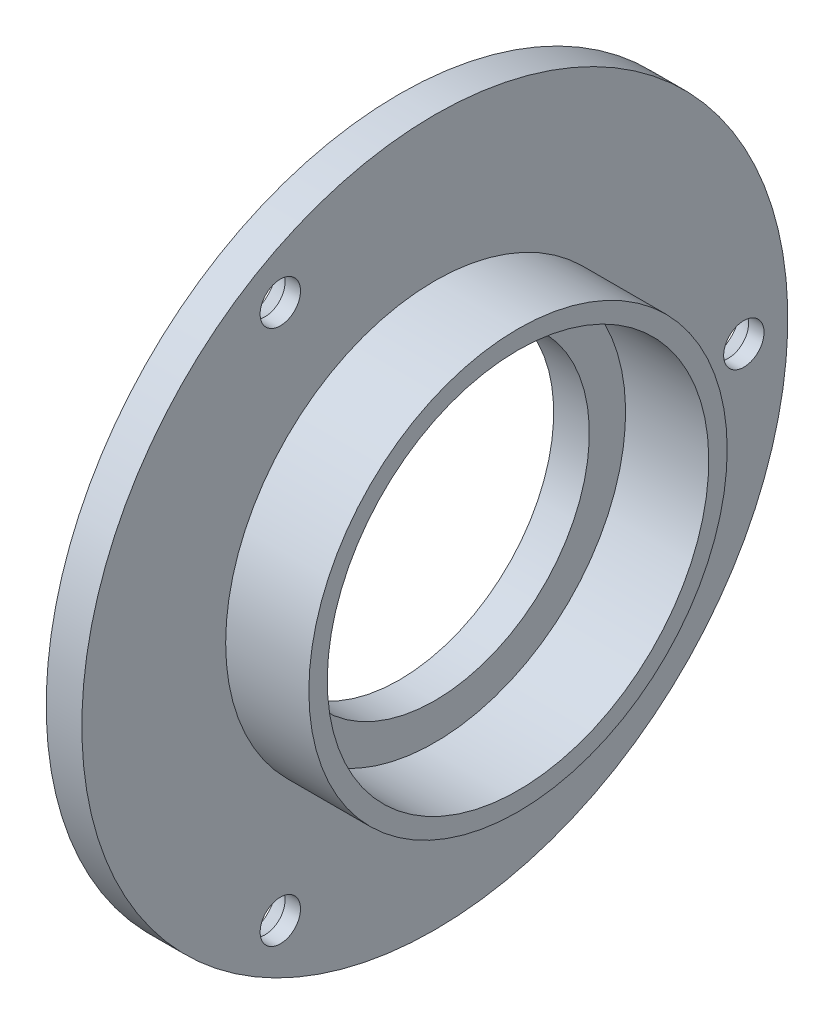
ISO-10303-21;
HEADER;
FILE_DESCRIPTION(('STEP AP214'),'2;1');
FILE_NAME('part.step','',(''),(''),'','','');
FILE_SCHEMA(('AUTOMOTIVE_DESIGN { 1 0 10303 214 1 1 1 1 }'));
ENDSEC;
DATA;
#1=APPLICATION_CONTEXT('core data for automotive mechanical design processes');
#2=APPLICATION_PROTOCOL_DEFINITION('international standard','automotive_design',2000,#1);
#3=PRODUCT_CONTEXT('',#1,'mechanical');
#4=PRODUCT('Part','Part','',(#3));
#5=PRODUCT_RELATED_PRODUCT_CATEGORY('part','',(#4));
#6=PRODUCT_DEFINITION_FORMATION('','',#4);
#7=PRODUCT_DEFINITION_CONTEXT('part definition',#1,'design');
#8=PRODUCT_DEFINITION('design','',#6,#7);
#9=PRODUCT_DEFINITION_SHAPE('','',#8);
#10=(LENGTH_UNIT() NAMED_UNIT(*) SI_UNIT(.MILLI.,.METRE.));
#11=(NAMED_UNIT(*) PLANE_ANGLE_UNIT() SI_UNIT($,.RADIAN.));
#12=(NAMED_UNIT(*) SI_UNIT($,.STERADIAN.) SOLID_ANGLE_UNIT());
#13=UNCERTAINTY_MEASURE_WITH_UNIT(LENGTH_MEASURE(1.E-05),#10,'distance_accuracy_value','');
#14=(GEOMETRIC_REPRESENTATION_CONTEXT(3) GLOBAL_UNCERTAINTY_ASSIGNED_CONTEXT((#13)) GLOBAL_UNIT_ASSIGNED_CONTEXT((#10,
#11,#12)) REPRESENTATION_CONTEXT('',''));
#15=CARTESIAN_POINT('',(0.,0.,0.));
#16=DIRECTION('',(0.,0.,1.));
#17=DIRECTION('',(1.,0.,0.));
#18=AXIS2_PLACEMENT_3D('',#15,#16,#17);
#19=CARTESIAN_POINT('',(-29.5,0.,0.));
#20=DIRECTION('',(1.,0.,0.));
#21=DIRECTION('',(0.,1.,0.));
#22=AXIS2_PLACEMENT_3D('',#19,#20,#21);
#23=PLANE('',#22);
#24=CARTESIAN_POINT('',(-29.5,0.,0.));
#25=DIRECTION('',(1.,0.,0.));
#26=DIRECTION('',(0.,1.,0.));
#27=AXIS2_PLACEMENT_3D('',#24,#25,#26);
#28=CIRCLE('',#27,16.05);
#29=CARTESIAN_POINT('',(-29.5,16.05,0.));
#30=VERTEX_POINT('',#29);
#31=EDGE_CURVE('E25',#30,#30,#28,.T.);
#32=ORIENTED_EDGE('',*,*,#31,.F.);
#33=EDGE_LOOP('',(#32));
#34=FACE_BOUND('',#33,.T.);
#35=CARTESIAN_POINT('',(-29.5,0.,0.));
#36=DIRECTION('',(1.,0.,0.));
#37=DIRECTION('',(0.,1.,0.));
#38=AXIS2_PLACEMENT_3D('',#35,#36,#37);
#39=CIRCLE('',#38,17.6);
#40=CARTESIAN_POINT('',(-29.5,17.6,0.));
#41=VERTEX_POINT('',#40);
#42=EDGE_CURVE('E46',#41,#41,#39,.T.);
#43=ORIENTED_EDGE('',*,*,#42,.T.);
#44=EDGE_LOOP('',(#43));
#45=FACE_BOUND('',#44,.T.);
#46=ADVANCED_FACE('F15',(#34,#45),#23,.T.);
#47=CARTESIAN_POINT('',(-29.5,0.,0.));
#48=DIRECTION('',(-1.,0.,0.));
#49=DIRECTION('',(0.,1.,0.));
#50=AXIS2_PLACEMENT_3D('',#47,#48,#49);
#51=CYLINDRICAL_SURFACE('',#50,16.05);
#52=ORIENTED_EDGE('',*,*,#31,.T.);
#53=DIRECTION('',(-1.,0.,0.));
#54=VECTOR('',#53,1.);
#55=CARTESIAN_POINT('',(-29.5,16.05,0.));
#56=LINE('',#55,#54);
#57=CARTESIAN_POINT('',(-36.5,16.05,0.));
#58=VERTEX_POINT('',#57);
#59=EDGE_CURVE('E10',#30,#58,#56,.T.);
#60=ORIENTED_EDGE('',*,*,#59,.T.);
#61=CARTESIAN_POINT('',(-36.5,0.,0.));
#62=DIRECTION('',(1.,0.,0.));
#63=DIRECTION('',(0.,1.,0.));
#64=AXIS2_PLACEMENT_3D('',#61,#62,#63);
#65=CIRCLE('',#64,16.05);
#66=EDGE_CURVE('E151',#58,#58,#65,.T.);
#67=ORIENTED_EDGE('',*,*,#66,.F.);
#68=ORIENTED_EDGE('',*,*,#59,.F.);
#69=EDGE_LOOP('',(#52,#60,#67,#68));
#70=FACE_BOUND('',#69,.T.);
#71=ADVANCED_FACE('F17',(#70),#51,.F.);
#72=CARTESIAN_POINT('',(-36.5,0.,0.));
#73=DIRECTION('',(1.,0.,0.));
#74=DIRECTION('',(0.,1.,0.));
#75=AXIS2_PLACEMENT_3D('',#72,#73,#74);
#76=CYLINDRICAL_SURFACE('',#75,17.6);
#77=CARTESIAN_POINT('',(-36.5,0.,0.));
#78=DIRECTION('',(1.,0.,0.));
#79=DIRECTION('',(0.,1.,0.));
#80=AXIS2_PLACEMENT_3D('',#77,#78,#79);
#81=CIRCLE('',#80,17.6);
#82=CARTESIAN_POINT('',(-36.5,17.6,0.));
#83=VERTEX_POINT('',#82);
#84=EDGE_CURVE('E147',#83,#83,#81,.T.);
#85=ORIENTED_EDGE('',*,*,#84,.T.);
#86=DIRECTION('',(1.,0.,0.));
#87=VECTOR('',#86,1.);
#88=CARTESIAN_POINT('',(-36.5,17.6,0.));
#89=LINE('',#88,#87);
#90=EDGE_CURVE('E150',#83,#41,#89,.T.);
#91=ORIENTED_EDGE('',*,*,#90,.T.);
#92=ORIENTED_EDGE('',*,*,#42,.F.);
#93=ORIENTED_EDGE('',*,*,#90,.F.);
#94=EDGE_LOOP('',(#85,#91,#92,#93));
#95=FACE_BOUND('',#94,.T.);
#96=ADVANCED_FACE('F217',(#95),#76,.T.);
#97=CARTESIAN_POINT('',(-39.6,-22.51666049839,13.));
#98=DIRECTION('',(1.,0.,0.));
#99=DIRECTION('',(0.,0.,-1.));
#100=AXIS2_PLACEMENT_3D('',#97,#98,#99);
#101=CYLINDRICAL_SURFACE('',#100,1.7);
#102=CARTESIAN_POINT('',(-37.8,-22.51666049839,13.));
#103=DIRECTION('',(1.,0.,0.));
#104=DIRECTION('',(0.,0.,-1.));
#105=AXIS2_PLACEMENT_3D('',#102,#103,#104);
#106=CIRCLE('',#105,1.7);
#107=CARTESIAN_POINT('',(-37.8,-22.51666049839,11.3));
#108=VERTEX_POINT('',#107);
#109=EDGE_CURVE('E177',#108,#108,#106,.T.);
#110=ORIENTED_EDGE('',*,*,#109,.F.);
#111=DIRECTION('',(1.,0.,0.));
#112=VECTOR('',#111,1.);
#113=CARTESIAN_POINT('',(-39.6,-22.51666049839,11.3));
#114=LINE('',#113,#112);
#115=CARTESIAN_POINT('',(-36.5,-22.51666049839,11.3));
#116=VERTEX_POINT('',#115);
#117=EDGE_CURVE('E148',#108,#116,#114,.T.);
#118=ORIENTED_EDGE('',*,*,#117,.T.);
#119=CARTESIAN_POINT('',(-36.5,-22.51666049839,13.));
#120=DIRECTION('',(1.,0.,0.));
#121=DIRECTION('',(0.,0.,-1.));
#122=AXIS2_PLACEMENT_3D('',#119,#120,#121);
#123=CIRCLE('',#122,1.7);
#124=EDGE_CURVE('E180',#116,#116,#123,.T.);
#125=ORIENTED_EDGE('',*,*,#124,.T.);
#126=ORIENTED_EDGE('',*,*,#117,.F.);
#127=EDGE_LOOP('',(#110,#118,#125,#126));
#128=FACE_BOUND('',#127,.T.);
#129=ADVANCED_FACE('F249',(#128),#101,.F.);
#130=CARTESIAN_POINT('',(-36.5,0.,0.));
#131=DIRECTION('',(1.,0.,0.));
#132=DIRECTION('',(0.,1.,0.));
#133=AXIS2_PLACEMENT_3D('',#130,#131,#132);
#134=PLANE('',#133);
#135=CARTESIAN_POINT('',(-36.5,0.,0.));
#136=DIRECTION('',(1.,0.,0.));
#137=DIRECTION('',(0.,1.,0.));
#138=AXIS2_PLACEMENT_3D('',#135,#136,#137);
#139=CIRCLE('',#138,13.);
#140=CARTESIAN_POINT('',(-36.5,13.,0.));
#141=VERTEX_POINT('',#140);
#142=EDGE_CURVE('E167',#141,#141,#139,.T.);
#143=ORIENTED_EDGE('',*,*,#142,.F.);
#144=EDGE_LOOP('',(#143));
#145=FACE_BOUND('',#144,.T.);
#146=ORIENTED_EDGE('',*,*,#66,.T.);
#147=EDGE_LOOP('',(#146));
#148=FACE_BOUND('',#147,.T.);
#149=ADVANCED_FACE('F251',(#145,#148),#134,.T.);
#150=CARTESIAN_POINT('',(-39.6,22.516660498395,13.));
#151=DIRECTION('',(1.,0.,0.));
#152=DIRECTION('',(0.,0.,-1.));
#153=AXIS2_PLACEMENT_3D('',#150,#151,#152);
#154=CYLINDRICAL_SURFACE('',#153,1.7);
#155=CARTESIAN_POINT('',(-37.8,22.516660498395,13.));
#156=DIRECTION('',(1.,0.,0.));
#157=DIRECTION('',(0.,0.,-1.));
#158=AXIS2_PLACEMENT_3D('',#155,#156,#157);
#159=CIRCLE('',#158,1.7);
#160=CARTESIAN_POINT('',(-37.8,22.516660498395,11.3));
#161=VERTEX_POINT('',#160);
#162=EDGE_CURVE('E142',#161,#161,#159,.T.);
#163=ORIENTED_EDGE('',*,*,#162,.F.);
#164=DIRECTION('',(1.,0.,0.));
#165=VECTOR('',#164,1.);
#166=CARTESIAN_POINT('',(-39.6,22.516660498395,11.3));
#167=LINE('',#166,#165);
#168=CARTESIAN_POINT('',(-36.5,22.516660498395,11.3));
#169=VERTEX_POINT('',#168);
#170=EDGE_CURVE('E129',#161,#169,#167,.T.);
#171=ORIENTED_EDGE('',*,*,#170,.T.);
#172=CARTESIAN_POINT('',(-36.5,22.516660498395,13.));
#173=DIRECTION('',(1.,0.,0.));
#174=DIRECTION('',(0.,0.,-1.));
#175=AXIS2_PLACEMENT_3D('',#172,#173,#174);
#176=CIRCLE('',#175,1.7);
#177=EDGE_CURVE('E130',#169,#169,#176,.T.);
#178=ORIENTED_EDGE('',*,*,#177,.T.);
#179=ORIENTED_EDGE('',*,*,#170,.F.);
#180=EDGE_LOOP('',(#163,#171,#178,#179));
#181=FACE_BOUND('',#180,.T.);
#182=ADVANCED_FACE('F234',(#181),#154,.F.);
#183=CARTESIAN_POINT('',(-39.6,0.,-26.));
#184=DIRECTION('',(1.,0.,0.));
#185=DIRECTION('',(0.,0.,-1.));
#186=AXIS2_PLACEMENT_3D('',#183,#184,#185);
#187=CYLINDRICAL_SURFACE('',#186,1.7);
#188=CARTESIAN_POINT('',(-37.8,0.,-26.));
#189=DIRECTION('',(1.,0.,0.));
#190=DIRECTION('',(0.,0.,-1.));
#191=AXIS2_PLACEMENT_3D('',#188,#189,#190);
#192=CIRCLE('',#191,1.7);
#193=CARTESIAN_POINT('',(-37.8,0.,-27.7));
#194=VERTEX_POINT('',#193);
#195=EDGE_CURVE('E124',#194,#194,#192,.T.);
#196=ORIENTED_EDGE('',*,*,#195,.F.);
#197=DIRECTION('',(1.,0.,0.));
#198=VECTOR('',#197,1.);
#199=CARTESIAN_POINT('',(-39.6,0.,-27.7));
#200=LINE('',#199,#198);
#201=CARTESIAN_POINT('',(-36.5,0.,-27.7));
#202=VERTEX_POINT('',#201);
#203=EDGE_CURVE('E121',#194,#202,#200,.T.);
#204=ORIENTED_EDGE('',*,*,#203,.T.);
#205=CARTESIAN_POINT('',(-36.5,0.,-26.));
#206=DIRECTION('',(1.,0.,0.));
#207=DIRECTION('',(0.,0.,-1.));
#208=AXIS2_PLACEMENT_3D('',#205,#206,#207);
#209=CIRCLE('',#208,1.7);
#210=EDGE_CURVE('E127',#202,#202,#209,.T.);
#211=ORIENTED_EDGE('',*,*,#210,.T.);
#212=ORIENTED_EDGE('',*,*,#203,.F.);
#213=EDGE_LOOP('',(#196,#204,#211,#212));
#214=FACE_BOUND('',#213,.T.);
#215=ADVANCED_FACE('F123',(#214),#187,.F.);
#216=CARTESIAN_POINT('',(-36.5,0.,0.));
#217=DIRECTION('',(1.,0.,0.));
#218=DIRECTION('',(0.,1.,0.));
#219=AXIS2_PLACEMENT_3D('',#216,#217,#218);
#220=PLANE('',#219);
#221=ORIENTED_EDGE('',*,*,#177,.F.);
#222=EDGE_LOOP('',(#221));
#223=FACE_BOUND('',#222,.T.);
#224=ORIENTED_EDGE('',*,*,#84,.F.);
#225=EDGE_LOOP('',(#224));
#226=FACE_BOUND('',#225,.T.);
#227=ORIENTED_EDGE('',*,*,#124,.F.);
#228=EDGE_LOOP('',(#227));
#229=FACE_BOUND('',#228,.T.);
#230=ORIENTED_EDGE('',*,*,#210,.F.);
#231=EDGE_LOOP('',(#230));
#232=FACE_BOUND('',#231,.T.);
#233=CARTESIAN_POINT('',(-36.5,0.,0.));
#234=DIRECTION('',(1.,0.,0.));
#235=DIRECTION('',(0.,1.,0.));
#236=AXIS2_PLACEMENT_3D('',#233,#234,#235);
#237=CIRCLE('',#236,29.7);
#238=CARTESIAN_POINT('',(-36.5,29.7,0.));
#239=VERTEX_POINT('',#238);
#240=EDGE_CURVE('E115',#239,#239,#237,.T.);
#241=ORIENTED_EDGE('',*,*,#240,.T.);
#242=EDGE_LOOP('',(#241));
#243=FACE_BOUND('',#242,.T.);
#244=ADVANCED_FACE('F219',(#223,#226,#229,#232,#243),#220,.T.);
#245=CARTESIAN_POINT('',(-39.5,-22.51666049839,13.));
#246=DIRECTION('',(-1.,0.,0.));
#247=DIRECTION('',(0.,0.,-1.));
#248=AXIS2_PLACEMENT_3D('',#245,#246,#247);
#249=CONICAL_SURFACE('',#248,2.75,0.553294325322);
#250=DIRECTION('',(0.850797997359174,0.,0.525492880722107));
#251=VECTOR('',#250,1.);
#252=CARTESIAN_POINT('',(-39.5,-22.51666049839,10.25));
#253=LINE('',#252,#251);
#254=CARTESIAN_POINT('',(-39.5,-22.51666049839,10.25));
#255=VERTEX_POINT('',#254);
#256=EDGE_CURVE('E173',#255,#108,#253,.T.);
#257=ORIENTED_EDGE('',*,*,#256,.F.);
#258=CARTESIAN_POINT('',(-39.5,-22.51666049839,13.));
#259=DIRECTION('',(1.,0.,0.));
#260=DIRECTION('',(0.,0.,-1.));
#261=AXIS2_PLACEMENT_3D('',#258,#259,#260);
#262=CIRCLE('',#261,2.75);
#263=EDGE_CURVE('E159',#255,#255,#262,.T.);
#264=ORIENTED_EDGE('',*,*,#263,.F.);
#265=ORIENTED_EDGE('',*,*,#256,.T.);
#266=ORIENTED_EDGE('',*,*,#109,.T.);
#267=EDGE_LOOP('',(#257,#264,#265,#266));
#268=FACE_BOUND('',#267,.T.);
#269=ADVANCED_FACE('F222',(#268),#249,.F.);
#270=CARTESIAN_POINT('',(-36.5,0.,0.));
#271=DIRECTION('',(-1.,0.,0.));
#272=DIRECTION('',(0.,1.,0.));
#273=AXIS2_PLACEMENT_3D('',#270,#271,#272);
#274=CYLINDRICAL_SURFACE('',#273,13.);
#275=ORIENTED_EDGE('',*,*,#142,.T.);
#276=DIRECTION('',(-1.,0.,0.));
#277=VECTOR('',#276,1.);
#278=CARTESIAN_POINT('',(-36.5,13.,0.));
#279=LINE('',#278,#277);
#280=CARTESIAN_POINT('',(-39.5,13.,0.));
#281=VERTEX_POINT('',#280);
#282=EDGE_CURVE('E86',#141,#281,#279,.T.);
#283=ORIENTED_EDGE('',*,*,#282,.T.);
#284=CARTESIAN_POINT('',(-39.5,0.,0.));
#285=DIRECTION('',(1.,0.,0.));
#286=DIRECTION('',(0.,1.,0.));
#287=AXIS2_PLACEMENT_3D('',#284,#285,#286);
#288=CIRCLE('',#287,13.);
#289=EDGE_CURVE('E163',#281,#281,#288,.T.);
#290=ORIENTED_EDGE('',*,*,#289,.F.);
#291=ORIENTED_EDGE('',*,*,#282,.F.);
#292=EDGE_LOOP('',(#275,#283,#290,#291));
#293=FACE_BOUND('',#292,.T.);
#294=ADVANCED_FACE('F231',(#293),#274,.F.);
#295=CARTESIAN_POINT('',(-39.5,22.516660498395,13.));
#296=DIRECTION('',(-1.,0.,0.));
#297=DIRECTION('',(0.,0.,-1.));
#298=AXIS2_PLACEMENT_3D('',#295,#296,#297);
#299=CONICAL_SURFACE('',#298,2.75,0.553294325322);
#300=DIRECTION('',(0.850797997359174,0.,0.525492880722107));
#301=VECTOR('',#300,1.);
#302=CARTESIAN_POINT('',(-39.5,22.516660498395,10.25));
#303=LINE('',#302,#301);
#304=CARTESIAN_POINT('',(-39.5,22.516660498395,10.25));
#305=VERTEX_POINT('',#304);
#306=EDGE_CURVE('E98',#305,#161,#303,.T.);
#307=ORIENTED_EDGE('',*,*,#306,.F.);
#308=CARTESIAN_POINT('',(-39.5,22.516660498395,13.));
#309=DIRECTION('',(1.,0.,0.));
#310=DIRECTION('',(0.,0.,-1.));
#311=AXIS2_PLACEMENT_3D('',#308,#309,#310);
#312=CIRCLE('',#311,2.75);
#313=EDGE_CURVE('E160',#305,#305,#312,.T.);
#314=ORIENTED_EDGE('',*,*,#313,.F.);
#315=ORIENTED_EDGE('',*,*,#306,.T.);
#316=ORIENTED_EDGE('',*,*,#162,.T.);
#317=EDGE_LOOP('',(#307,#314,#315,#316));
#318=FACE_BOUND('',#317,.T.);
#319=ADVANCED_FACE('F255',(#318),#299,.F.);
#320=CARTESIAN_POINT('',(-39.5,0.,-26.));
#321=DIRECTION('',(-1.,0.,0.));
#322=DIRECTION('',(0.,0.,-1.));
#323=AXIS2_PLACEMENT_3D('',#320,#321,#322);
#324=CONICAL_SURFACE('',#323,2.75,0.553294325322);
#325=DIRECTION('',(0.850797997359174,0.,0.525492880722107));
#326=VECTOR('',#325,1.);
#327=CARTESIAN_POINT('',(-39.5,0.,-28.75));
#328=LINE('',#327,#326);
#329=CARTESIAN_POINT('',(-39.5,0.,-28.75));
#330=VERTEX_POINT('',#329);
#331=EDGE_CURVE('E19',#330,#194,#328,.T.);
#332=ORIENTED_EDGE('',*,*,#331,.F.);
#333=CARTESIAN_POINT('',(-39.5,0.,-26.));
#334=DIRECTION('',(1.,0.,0.));
#335=DIRECTION('',(0.,0.,-1.));
#336=AXIS2_PLACEMENT_3D('',#333,#334,#335);
#337=CIRCLE('',#336,2.75);
#338=EDGE_CURVE('E164',#330,#330,#337,.T.);
#339=ORIENTED_EDGE('',*,*,#338,.F.);
#340=ORIENTED_EDGE('',*,*,#331,.T.);
#341=ORIENTED_EDGE('',*,*,#195,.T.);
#342=EDGE_LOOP('',(#332,#339,#340,#341));
#343=FACE_BOUND('',#342,.T.);
#344=ADVANCED_FACE('F133',(#343),#324,.F.);
#345=CARTESIAN_POINT('',(-39.5,0.,0.));
#346=DIRECTION('',(1.,0.,0.));
#347=DIRECTION('',(0.,1.,0.));
#348=AXIS2_PLACEMENT_3D('',#345,#346,#347);
#349=CYLINDRICAL_SURFACE('',#348,29.7);
#350=CARTESIAN_POINT('',(-39.5,0.,0.));
#351=DIRECTION('',(1.,0.,0.));
#352=DIRECTION('',(0.,1.,0.));
#353=AXIS2_PLACEMENT_3D('',#350,#351,#352);
#354=CIRCLE('',#353,29.7);
#355=CARTESIAN_POINT('',(-39.5,29.7,0.));
#356=VERTEX_POINT('',#355);
#357=EDGE_CURVE('E183',#356,#356,#354,.T.);
#358=ORIENTED_EDGE('',*,*,#357,.T.);
#359=DIRECTION('',(1.,0.,0.));
#360=VECTOR('',#359,1.);
#361=CARTESIAN_POINT('',(-39.5,29.7,0.));
#362=LINE('',#361,#360);
#363=EDGE_CURVE('E155',#356,#239,#362,.T.);
#364=ORIENTED_EDGE('',*,*,#363,.T.);
#365=ORIENTED_EDGE('',*,*,#240,.F.);
#366=ORIENTED_EDGE('',*,*,#363,.F.);
#367=EDGE_LOOP('',(#358,#364,#365,#366));
#368=FACE_BOUND('',#367,.T.);
#369=ADVANCED_FACE('F261',(#368),#349,.T.);
#370=CARTESIAN_POINT('',(-39.5,0.,0.));
#371=DIRECTION('',(1.,0.,0.));
#372=DIRECTION('',(0.,1.,0.));
#373=AXIS2_PLACEMENT_3D('',#370,#371,#372);
#374=PLANE('',#373);
#375=ORIENTED_EDGE('',*,*,#263,.T.);
#376=EDGE_LOOP('',(#375));
#377=FACE_BOUND('',#376,.T.);
#378=ORIENTED_EDGE('',*,*,#289,.T.);
#379=EDGE_LOOP('',(#378));
#380=FACE_BOUND('',#379,.T.);
#381=ORIENTED_EDGE('',*,*,#313,.T.);
#382=EDGE_LOOP('',(#381));
#383=FACE_BOUND('',#382,.T.);
#384=ORIENTED_EDGE('',*,*,#338,.T.);
#385=EDGE_LOOP('',(#384));
#386=FACE_BOUND('',#385,.T.);
#387=ORIENTED_EDGE('',*,*,#357,.F.);
#388=EDGE_LOOP('',(#387));
#389=FACE_BOUND('',#388,.T.);
#390=ADVANCED_FACE('F265',(#377,#380,#383,#386,#389),#374,.F.);
#391=CLOSED_SHELL('',(#46,#71,#96,#129,#149,#182,#215,#244,#269,#294,#319,#344,#369,#390));
#392=MANIFOLD_SOLID_BREP('B1',#391);
#393=ADVANCED_BREP_SHAPE_REPRESENTATION('',(#18,#392),#14);
#394=SHAPE_DEFINITION_REPRESENTATION(#9,#393);
ENDSEC;
END-ISO-10303-21;
